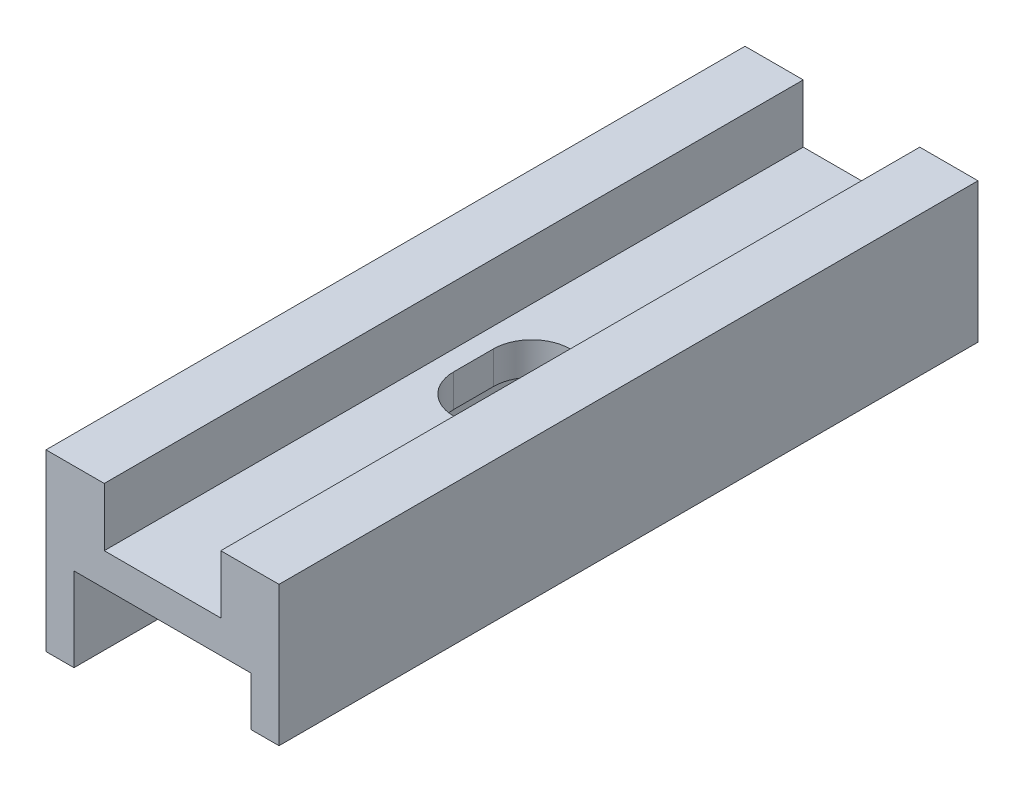
ISO-10303-21;
HEADER;
FILE_DESCRIPTION(('STEP AP214'),'2;1');
FILE_NAME('part.step','',(''),(''),'','','');
FILE_SCHEMA(('AUTOMOTIVE_DESIGN { 1 0 10303 214 1 1 1 1 }'));
ENDSEC;
DATA;
#1=APPLICATION_CONTEXT('core data for automotive mechanical design processes');
#2=APPLICATION_PROTOCOL_DEFINITION('international standard','automotive_design',2000,#1);
#3=PRODUCT_CONTEXT('',#1,'mechanical');
#4=PRODUCT('Part','Part','',(#3));
#5=PRODUCT_RELATED_PRODUCT_CATEGORY('part','',(#4));
#6=PRODUCT_DEFINITION_FORMATION('','',#4);
#7=PRODUCT_DEFINITION_CONTEXT('part definition',#1,'design');
#8=PRODUCT_DEFINITION('design','',#6,#7);
#9=PRODUCT_DEFINITION_SHAPE('','',#8);
#10=(LENGTH_UNIT() NAMED_UNIT(*) SI_UNIT(.MILLI.,.METRE.));
#11=(NAMED_UNIT(*) PLANE_ANGLE_UNIT() SI_UNIT($,.RADIAN.));
#12=(NAMED_UNIT(*) SI_UNIT($,.STERADIAN.) SOLID_ANGLE_UNIT());
#13=UNCERTAINTY_MEASURE_WITH_UNIT(LENGTH_MEASURE(1.E-05),#10,'distance_accuracy_value','');
#14=(GEOMETRIC_REPRESENTATION_CONTEXT(3) GLOBAL_UNCERTAINTY_ASSIGNED_CONTEXT((#13)) GLOBAL_UNIT_ASSIGNED_CONTEXT((#10,
#11,#12)) REPRESENTATION_CONTEXT('',''));
#15=CARTESIAN_POINT('',(0.,0.,0.));
#16=DIRECTION('',(0.,0.,1.));
#17=DIRECTION('',(1.,0.,0.));
#18=AXIS2_PLACEMENT_3D('',#15,#16,#17);
#19=CARTESIAN_POINT('',(6.35,1.26999999999999,38.1));
#20=DIRECTION('',(-1.,0.,0.));
#21=DIRECTION('',(0.,-1.,0.));
#22=AXIS2_PLACEMENT_3D('',#19,#20,#21);
#23=PLANE('',#22);
#24=DIRECTION('',(0.,1.,0.));
#25=VECTOR('',#24,1.);
#26=CARTESIAN_POINT('',(6.35,1.26999999999999,-38.1));
#27=LINE('',#26,#25);
#28=CARTESIAN_POINT('',(6.35,1.26999999999999,-38.1));
#29=VERTEX_POINT('',#28);
#30=CARTESIAN_POINT('',(6.35,7.62,-38.1));
#31=VERTEX_POINT('',#30);
#32=EDGE_CURVE('E160',#29,#31,#27,.T.);
#33=ORIENTED_EDGE('',*,*,#32,.F.);
#34=DIRECTION('',(0.,0.,-1.));
#35=VECTOR('',#34,1.);
#36=CARTESIAN_POINT('',(6.35,1.26999999999999,38.1));
#37=LINE('',#36,#35);
#38=CARTESIAN_POINT('',(6.35,1.26999999999999,38.1));
#39=VERTEX_POINT('',#38);
#40=EDGE_CURVE('E11',#39,#29,#37,.T.);
#41=ORIENTED_EDGE('',*,*,#40,.F.);
#42=DIRECTION('',(0.,1.,0.));
#43=VECTOR('',#42,1.);
#44=CARTESIAN_POINT('',(6.35,1.26999999999999,38.1));
#45=LINE('',#44,#43);
#46=CARTESIAN_POINT('',(6.35,7.62,38.1));
#47=VERTEX_POINT('',#46);
#48=EDGE_CURVE('E199',#39,#47,#45,.T.);
#49=ORIENTED_EDGE('',*,*,#48,.T.);
#50=DIRECTION('',(0.,0.,-1.));
#51=VECTOR('',#50,1.);
#52=CARTESIAN_POINT('',(6.35,7.62,38.1));
#53=LINE('',#52,#51);
#54=EDGE_CURVE('E42',#47,#31,#53,.T.);
#55=ORIENTED_EDGE('',*,*,#54,.T.);
#56=EDGE_LOOP('',(#33,#41,#49,#55));
#57=FACE_BOUND('',#56,.T.);
#58=ADVANCED_FACE('F39',(#57),#23,.T.);
#59=CARTESIAN_POINT('',(-6.35,1.26999999999999,38.1));
#60=DIRECTION('',(0.,1.,0.));
#61=DIRECTION('',(0.,0.,1.));
#62=AXIS2_PLACEMENT_3D('',#59,#60,#61);
#63=PLANE('',#62);
#64=DIRECTION('',(0.,0.,1.));
#65=VECTOR('',#64,1.);
#66=CARTESIAN_POINT('',(-4.191,1.26999999999999,-2.159));
#67=LINE('',#66,#65);
#68=CARTESIAN_POINT('',(-4.191,1.26999999999999,-2.159));
#69=VERTEX_POINT('',#68);
#70=CARTESIAN_POINT('',(-4.191,1.26999999999999,2.159));
#71=VERTEX_POINT('',#70);
#72=EDGE_CURVE('E56',#69,#71,#67,.T.);
#73=ORIENTED_EDGE('',*,*,#72,.F.);
#74=CARTESIAN_POINT('',(0.,1.26999999999999,-2.159));
#75=DIRECTION('',(0.,1.,0.));
#76=DIRECTION('',(0.,0.,1.));
#77=AXIS2_PLACEMENT_3D('',#74,#75,#76);
#78=CIRCLE('',#77,4.191);
#79=CARTESIAN_POINT('',(4.191,1.26999999999999,-2.159));
#80=VERTEX_POINT('',#79);
#81=EDGE_CURVE('E167',#80,#69,#78,.T.);
#82=ORIENTED_EDGE('',*,*,#81,.F.);
#83=DIRECTION('',(0.,0.,1.));
#84=VECTOR('',#83,1.);
#85=CARTESIAN_POINT('',(4.191,1.26999999999999,-2.159));
#86=LINE('',#85,#84);
#87=CARTESIAN_POINT('',(4.191,1.26999999999999,2.159));
#88=VERTEX_POINT('',#87);
#89=EDGE_CURVE('E185',#80,#88,#86,.T.);
#90=ORIENTED_EDGE('',*,*,#89,.T.);
#91=CARTESIAN_POINT('',(0.,1.26999999999999,2.159));
#92=DIRECTION('',(0.,1.,0.));
#93=DIRECTION('',(0.,0.,1.));
#94=AXIS2_PLACEMENT_3D('',#91,#92,#93);
#95=CIRCLE('',#94,4.191);
#96=EDGE_CURVE('E177',#71,#88,#95,.T.);
#97=ORIENTED_EDGE('',*,*,#96,.F.);
#98=EDGE_LOOP('',(#73,#82,#90,#97));
#99=FACE_BOUND('',#98,.T.);
#100=DIRECTION('',(1.,0.,0.));
#101=VECTOR('',#100,1.);
#102=CARTESIAN_POINT('',(-6.35,1.26999999999999,-38.1));
#103=LINE('',#102,#101);
#104=CARTESIAN_POINT('',(-6.35,1.26999999999999,-38.1));
#105=VERTEX_POINT('',#104);
#106=EDGE_CURVE('E204',#105,#29,#103,.T.);
#107=ORIENTED_EDGE('',*,*,#106,.F.);
#108=DIRECTION('',(0.,0.,-1.));
#109=VECTOR('',#108,1.);
#110=CARTESIAN_POINT('',(-6.35,1.26999999999999,38.1));
#111=LINE('',#110,#109);
#112=CARTESIAN_POINT('',(-6.35,1.26999999999999,38.1));
#113=VERTEX_POINT('',#112);
#114=EDGE_CURVE('E48',#113,#105,#111,.T.);
#115=ORIENTED_EDGE('',*,*,#114,.F.);
#116=DIRECTION('',(1.,0.,0.));
#117=VECTOR('',#116,1.);
#118=CARTESIAN_POINT('',(-6.35,1.26999999999999,38.1));
#119=LINE('',#118,#117);
#120=EDGE_CURVE('E244',#113,#39,#119,.T.);
#121=ORIENTED_EDGE('',*,*,#120,.T.);
#122=ORIENTED_EDGE('',*,*,#40,.T.);
#123=EDGE_LOOP('',(#107,#115,#121,#122));
#124=FACE_BOUND('',#123,.T.);
#125=ADVANCED_FACE('F335',(#99,#124),#63,.T.);
#126=CARTESIAN_POINT('',(-6.35,7.61999999999999,38.1));
#127=DIRECTION('',(1.,0.,0.));
#128=DIRECTION('',(0.,1.,0.));
#129=AXIS2_PLACEMENT_3D('',#126,#127,#128);
#130=PLANE('',#129);
#131=DIRECTION('',(0.,-1.,0.));
#132=VECTOR('',#131,1.);
#133=CARTESIAN_POINT('',(-6.35,7.61999999999999,-38.1));
#134=LINE('',#133,#132);
#135=CARTESIAN_POINT('',(-6.35,7.61999999999999,-38.1));
#136=VERTEX_POINT('',#135);
#137=EDGE_CURVE('E287',#136,#105,#134,.T.);
#138=ORIENTED_EDGE('',*,*,#137,.F.);
#139=DIRECTION('',(0.,0.,-1.));
#140=VECTOR('',#139,1.);
#141=CARTESIAN_POINT('',(-6.35,7.61999999999999,38.1));
#142=LINE('',#141,#140);
#143=CARTESIAN_POINT('',(-6.35,7.61999999999999,38.1));
#144=VERTEX_POINT('',#143);
#145=EDGE_CURVE('E296',#144,#136,#142,.T.);
#146=ORIENTED_EDGE('',*,*,#145,.F.);
#147=DIRECTION('',(0.,-1.,0.));
#148=VECTOR('',#147,1.);
#149=CARTESIAN_POINT('',(-6.35,7.61999999999999,38.1));
#150=LINE('',#149,#148);
#151=EDGE_CURVE('E240',#144,#113,#150,.T.);
#152=ORIENTED_EDGE('',*,*,#151,.T.);
#153=ORIENTED_EDGE('',*,*,#114,.T.);
#154=EDGE_LOOP('',(#138,#146,#152,#153));
#155=FACE_BOUND('',#154,.T.);
#156=ADVANCED_FACE('F370',(#155),#130,.T.);
#157=CARTESIAN_POINT('',(-12.7,7.62,38.1));
#158=DIRECTION('',(0.,1.,0.));
#159=DIRECTION('',(-1.,0.,0.));
#160=AXIS2_PLACEMENT_3D('',#157,#158,#159);
#161=PLANE('',#160);
#162=DIRECTION('',(1.,0.,0.));
#163=VECTOR('',#162,1.);
#164=CARTESIAN_POINT('',(-12.7,7.62,-38.1));
#165=LINE('',#164,#163);
#166=CARTESIAN_POINT('',(-12.7,7.62,-38.1));
#167=VERTEX_POINT('',#166);
#168=EDGE_CURVE('E283',#167,#136,#165,.T.);
#169=ORIENTED_EDGE('',*,*,#168,.F.);
#170=DIRECTION('',(0.,0.,-1.));
#171=VECTOR('',#170,1.);
#172=CARTESIAN_POINT('',(-12.7,7.62,38.1));
#173=LINE('',#172,#171);
#174=CARTESIAN_POINT('',(-12.7,7.62,38.1));
#175=VERTEX_POINT('',#174);
#176=EDGE_CURVE('E299',#175,#167,#173,.T.);
#177=ORIENTED_EDGE('',*,*,#176,.F.);
#178=DIRECTION('',(1.,0.,0.));
#179=VECTOR('',#178,1.);
#180=CARTESIAN_POINT('',(-12.7,7.62,38.1));
#181=LINE('',#180,#179);
#182=EDGE_CURVE('E236',#175,#144,#181,.T.);
#183=ORIENTED_EDGE('',*,*,#182,.T.);
#184=ORIENTED_EDGE('',*,*,#145,.T.);
#185=EDGE_LOOP('',(#169,#177,#183,#184));
#186=FACE_BOUND('',#185,.T.);
#187=ADVANCED_FACE('F367',(#186),#161,.T.);
#188=CARTESIAN_POINT('',(-12.7,-11.43,38.1));
#189=DIRECTION('',(-1.,0.,0.));
#190=DIRECTION('',(0.,-1.,0.));
#191=AXIS2_PLACEMENT_3D('',#188,#189,#190);
#192=PLANE('',#191);
#193=DIRECTION('',(0.,1.,0.));
#194=VECTOR('',#193,1.);
#195=CARTESIAN_POINT('',(-12.7,-11.43,-38.1));
#196=LINE('',#195,#194);
#197=CARTESIAN_POINT('',(-12.7,-11.43,-38.1));
#198=VERTEX_POINT('',#197);
#199=EDGE_CURVE('E279',#198,#167,#196,.T.);
#200=ORIENTED_EDGE('',*,*,#199,.F.);
#201=DIRECTION('',(0.,0.,-1.));
#202=VECTOR('',#201,1.);
#203=CARTESIAN_POINT('',(-12.7,-11.43,38.1));
#204=LINE('',#203,#202);
#205=CARTESIAN_POINT('',(-12.7,-11.43,38.1));
#206=VERTEX_POINT('',#205);
#207=EDGE_CURVE('E302',#206,#198,#204,.T.);
#208=ORIENTED_EDGE('',*,*,#207,.F.);
#209=DIRECTION('',(0.,1.,0.));
#210=VECTOR('',#209,1.);
#211=CARTESIAN_POINT('',(-12.7,-11.43,38.1));
#212=LINE('',#211,#210);
#213=EDGE_CURVE('E232',#206,#175,#212,.T.);
#214=ORIENTED_EDGE('',*,*,#213,.T.);
#215=ORIENTED_EDGE('',*,*,#176,.T.);
#216=EDGE_LOOP('',(#200,#208,#214,#215));
#217=FACE_BOUND('',#216,.T.);
#218=ADVANCED_FACE('F364',(#217),#192,.T.);
#219=CARTESIAN_POINT('',(-9.652,-11.43,38.1));
#220=DIRECTION('',(0.,-1.,0.));
#221=DIRECTION('',(1.,0.,0.));
#222=AXIS2_PLACEMENT_3D('',#219,#220,#221);
#223=PLANE('',#222);
#224=DIRECTION('',(-1.,0.,0.));
#225=VECTOR('',#224,1.);
#226=CARTESIAN_POINT('',(-9.652,-11.43,-38.1));
#227=LINE('',#226,#225);
#228=CARTESIAN_POINT('',(-9.652,-11.43,-38.1));
#229=VERTEX_POINT('',#228);
#230=EDGE_CURVE('E275',#229,#198,#227,.T.);
#231=ORIENTED_EDGE('',*,*,#230,.F.);
#232=DIRECTION('',(0.,0.,-1.));
#233=VECTOR('',#232,1.);
#234=CARTESIAN_POINT('',(-9.652,-11.43,38.1));
#235=LINE('',#234,#233);
#236=CARTESIAN_POINT('',(-9.652,-11.43,38.1));
#237=VERTEX_POINT('',#236);
#238=EDGE_CURVE('E305',#237,#229,#235,.T.);
#239=ORIENTED_EDGE('',*,*,#238,.F.);
#240=DIRECTION('',(-1.,0.,0.));
#241=VECTOR('',#240,1.);
#242=CARTESIAN_POINT('',(-9.652,-11.43,38.1));
#243=LINE('',#242,#241);
#244=EDGE_CURVE('E228',#237,#206,#243,.T.);
#245=ORIENTED_EDGE('',*,*,#244,.T.);
#246=ORIENTED_EDGE('',*,*,#207,.T.);
#247=EDGE_LOOP('',(#231,#239,#245,#246));
#248=FACE_BOUND('',#247,.T.);
#249=ADVANCED_FACE('F360',(#248),#223,.T.);
#250=CARTESIAN_POINT('',(-9.652,-2.286,38.1));
#251=DIRECTION('',(1.,0.,0.));
#252=DIRECTION('',(0.,1.,0.));
#253=AXIS2_PLACEMENT_3D('',#250,#251,#252);
#254=PLANE('',#253);
#255=DIRECTION('',(0.,-1.,0.));
#256=VECTOR('',#255,1.);
#257=CARTESIAN_POINT('',(-9.652,-2.286,-38.1));
#258=LINE('',#257,#256);
#259=CARTESIAN_POINT('',(-9.652,-2.286,-38.1));
#260=VERTEX_POINT('',#259);
#261=EDGE_CURVE('E271',#260,#229,#258,.T.);
#262=ORIENTED_EDGE('',*,*,#261,.F.);
#263=DIRECTION('',(0.,0.,-1.));
#264=VECTOR('',#263,1.);
#265=CARTESIAN_POINT('',(-9.652,-2.286,38.1));
#266=LINE('',#265,#264);
#267=CARTESIAN_POINT('',(-9.652,-2.286,38.1));
#268=VERTEX_POINT('',#267);
#269=EDGE_CURVE('E308',#268,#260,#266,.T.);
#270=ORIENTED_EDGE('',*,*,#269,.F.);
#271=DIRECTION('',(0.,-1.,0.));
#272=VECTOR('',#271,1.);
#273=CARTESIAN_POINT('',(-9.652,-2.286,38.1));
#274=LINE('',#273,#272);
#275=EDGE_CURVE('E224',#268,#237,#274,.T.);
#276=ORIENTED_EDGE('',*,*,#275,.T.);
#277=ORIENTED_EDGE('',*,*,#238,.T.);
#278=EDGE_LOOP('',(#262,#270,#276,#277));
#279=FACE_BOUND('',#278,.T.);
#280=ADVANCED_FACE('F356',(#279),#254,.T.);
#281=CARTESIAN_POINT('',(9.65199999999999,-2.286,38.1));
#282=DIRECTION('',(0.,-1.,0.));
#283=DIRECTION('',(1.,0.,0.));
#284=AXIS2_PLACEMENT_3D('',#281,#282,#283);
#285=PLANE('',#284);
#286=DIRECTION('',(0.,0.,1.));
#287=VECTOR('',#286,1.);
#288=CARTESIAN_POINT('',(-4.191,-2.286,-2.159));
#289=LINE('',#288,#287);
#290=CARTESIAN_POINT('',(-4.191,-2.286,-2.159));
#291=VERTEX_POINT('',#290);
#292=CARTESIAN_POINT('',(-4.191,-2.286,2.159));
#293=VERTEX_POINT('',#292);
#294=EDGE_CURVE('E164',#291,#293,#289,.T.);
#295=ORIENTED_EDGE('',*,*,#294,.T.);
#296=CARTESIAN_POINT('',(0.,-2.286,2.159));
#297=DIRECTION('',(0.,-1.,0.));
#298=DIRECTION('',(1.,0.,0.));
#299=AXIS2_PLACEMENT_3D('',#296,#297,#298);
#300=CIRCLE('',#299,4.191);
#301=CARTESIAN_POINT('',(4.191,-2.286,2.159));
#302=VERTEX_POINT('',#301);
#303=EDGE_CURVE('E152',#293,#302,#300,.F.);
#304=ORIENTED_EDGE('',*,*,#303,.T.);
#305=DIRECTION('',(0.,0.,1.));
#306=VECTOR('',#305,1.);
#307=CARTESIAN_POINT('',(4.191,-2.286,-2.159));
#308=LINE('',#307,#306);
#309=CARTESIAN_POINT('',(4.191,-2.286,-2.159));
#310=VERTEX_POINT('',#309);
#311=EDGE_CURVE('E179',#310,#302,#308,.T.);
#312=ORIENTED_EDGE('',*,*,#311,.F.);
#313=CARTESIAN_POINT('',(0.,-2.286,-2.159));
#314=DIRECTION('',(0.,-1.,0.));
#315=DIRECTION('',(1.,0.,0.));
#316=AXIS2_PLACEMENT_3D('',#313,#314,#315);
#317=CIRCLE('',#316,4.191);
#318=EDGE_CURVE('E172',#310,#291,#317,.F.);
#319=ORIENTED_EDGE('',*,*,#318,.T.);
#320=EDGE_LOOP('',(#295,#304,#312,#319));
#321=FACE_BOUND('',#320,.T.);
#322=DIRECTION('',(-1.,0.,0.));
#323=VECTOR('',#322,1.);
#324=CARTESIAN_POINT('',(9.65199999999999,-2.286,-38.1));
#325=LINE('',#324,#323);
#326=CARTESIAN_POINT('',(9.65199999999999,-2.286,-38.1));
#327=VERTEX_POINT('',#326);
#328=EDGE_CURVE('E267',#327,#260,#325,.T.);
#329=ORIENTED_EDGE('',*,*,#328,.F.);
#330=DIRECTION('',(0.,0.,-1.));
#331=VECTOR('',#330,1.);
#332=CARTESIAN_POINT('',(9.65199999999999,-2.286,38.1));
#333=LINE('',#332,#331);
#334=CARTESIAN_POINT('',(9.65199999999999,-2.286,38.1));
#335=VERTEX_POINT('',#334);
#336=EDGE_CURVE('E311',#335,#327,#333,.T.);
#337=ORIENTED_EDGE('',*,*,#336,.F.);
#338=DIRECTION('',(-1.,0.,0.));
#339=VECTOR('',#338,1.);
#340=CARTESIAN_POINT('',(9.65199999999999,-2.286,38.1));
#341=LINE('',#340,#339);
#342=EDGE_CURVE('E220',#335,#268,#341,.T.);
#343=ORIENTED_EDGE('',*,*,#342,.T.);
#344=ORIENTED_EDGE('',*,*,#269,.T.);
#345=EDGE_LOOP('',(#329,#337,#343,#344));
#346=FACE_BOUND('',#345,.T.);
#347=ADVANCED_FACE('F170',(#321,#346),#285,.T.);
#348=CARTESIAN_POINT('',(9.652,-7.61999999999999,38.1));
#349=DIRECTION('',(-1.,0.,0.));
#350=DIRECTION('',(0.,-1.,0.));
#351=AXIS2_PLACEMENT_3D('',#348,#349,#350);
#352=PLANE('',#351);
#353=DIRECTION('',(0.,1.,0.));
#354=VECTOR('',#353,1.);
#355=CARTESIAN_POINT('',(9.652,-7.61999999999999,-38.1));
#356=LINE('',#355,#354);
#357=CARTESIAN_POINT('',(9.652,-7.61999999999999,-38.1));
#358=VERTEX_POINT('',#357);
#359=EDGE_CURVE('E263',#358,#327,#356,.T.);
#360=ORIENTED_EDGE('',*,*,#359,.F.);
#361=DIRECTION('',(0.,0.,-1.));
#362=VECTOR('',#361,1.);
#363=CARTESIAN_POINT('',(9.652,-7.61999999999999,38.1));
#364=LINE('',#363,#362);
#365=CARTESIAN_POINT('',(9.652,-7.61999999999999,38.1));
#366=VERTEX_POINT('',#365);
#367=EDGE_CURVE('E314',#366,#358,#364,.T.);
#368=ORIENTED_EDGE('',*,*,#367,.F.);
#369=DIRECTION('',(0.,1.,0.));
#370=VECTOR('',#369,1.);
#371=CARTESIAN_POINT('',(9.652,-7.61999999999999,38.1));
#372=LINE('',#371,#370);
#373=EDGE_CURVE('E216',#366,#335,#372,.T.);
#374=ORIENTED_EDGE('',*,*,#373,.T.);
#375=ORIENTED_EDGE('',*,*,#336,.T.);
#376=EDGE_LOOP('',(#360,#368,#374,#375));
#377=FACE_BOUND('',#376,.T.);
#378=ADVANCED_FACE('F350',(#377),#352,.T.);
#379=CARTESIAN_POINT('',(12.7,-7.61999999999999,38.1));
#380=DIRECTION('',(0.,-1.,0.));
#381=DIRECTION('',(1.,0.,0.));
#382=AXIS2_PLACEMENT_3D('',#379,#380,#381);
#383=PLANE('',#382);
#384=DIRECTION('',(-1.,0.,0.));
#385=VECTOR('',#384,1.);
#386=CARTESIAN_POINT('',(12.7,-7.61999999999999,-38.1));
#387=LINE('',#386,#385);
#388=CARTESIAN_POINT('',(12.7,-7.61999999999999,-38.1));
#389=VERTEX_POINT('',#388);
#390=EDGE_CURVE('E259',#389,#358,#387,.T.);
#391=ORIENTED_EDGE('',*,*,#390,.F.);
#392=DIRECTION('',(0.,0.,-1.));
#393=VECTOR('',#392,1.);
#394=CARTESIAN_POINT('',(12.7,-7.61999999999999,38.1));
#395=LINE('',#394,#393);
#396=CARTESIAN_POINT('',(12.7,-7.61999999999999,38.1));
#397=VERTEX_POINT('',#396);
#398=EDGE_CURVE('E317',#397,#389,#395,.T.);
#399=ORIENTED_EDGE('',*,*,#398,.F.);
#400=DIRECTION('',(-1.,0.,0.));
#401=VECTOR('',#400,1.);
#402=CARTESIAN_POINT('',(12.7,-7.61999999999999,38.1));
#403=LINE('',#402,#401);
#404=EDGE_CURVE('E212',#397,#366,#403,.T.);
#405=ORIENTED_EDGE('',*,*,#404,.T.);
#406=ORIENTED_EDGE('',*,*,#367,.T.);
#407=EDGE_LOOP('',(#391,#399,#405,#406));
#408=FACE_BOUND('',#407,.T.);
#409=ADVANCED_FACE('F348',(#408),#383,.T.);
#410=CARTESIAN_POINT('',(12.7,7.61999999999999,38.1));
#411=DIRECTION('',(1.,0.,0.));
#412=DIRECTION('',(0.,1.,0.));
#413=AXIS2_PLACEMENT_3D('',#410,#411,#412);
#414=PLANE('',#413);
#415=DIRECTION('',(0.,-1.,0.));
#416=VECTOR('',#415,1.);
#417=CARTESIAN_POINT('',(12.7,7.61999999999999,-38.1));
#418=LINE('',#417,#416);
#419=CARTESIAN_POINT('',(12.7,7.61999999999999,-38.1));
#420=VERTEX_POINT('',#419);
#421=EDGE_CURVE('E255',#420,#389,#418,.T.);
#422=ORIENTED_EDGE('',*,*,#421,.F.);
#423=DIRECTION('',(0.,0.,-1.));
#424=VECTOR('',#423,1.);
#425=CARTESIAN_POINT('',(12.7,7.61999999999999,38.1));
#426=LINE('',#425,#424);
#427=CARTESIAN_POINT('',(12.7,7.61999999999999,38.1));
#428=VERTEX_POINT('',#427);
#429=EDGE_CURVE('E319',#428,#420,#426,.T.);
#430=ORIENTED_EDGE('',*,*,#429,.F.);
#431=DIRECTION('',(0.,-1.,0.));
#432=VECTOR('',#431,1.);
#433=CARTESIAN_POINT('',(12.7,7.61999999999999,38.1));
#434=LINE('',#433,#432);
#435=EDGE_CURVE('E208',#428,#397,#434,.T.);
#436=ORIENTED_EDGE('',*,*,#435,.T.);
#437=ORIENTED_EDGE('',*,*,#398,.T.);
#438=EDGE_LOOP('',(#422,#430,#436,#437));
#439=FACE_BOUND('',#438,.T.);
#440=ADVANCED_FACE('F344',(#439),#414,.T.);
#441=CARTESIAN_POINT('',(6.35,7.62,38.1));
#442=DIRECTION('',(0.,1.,0.));
#443=DIRECTION('',(-1.,0.,0.));
#444=AXIS2_PLACEMENT_3D('',#441,#442,#443);
#445=PLANE('',#444);
#446=DIRECTION('',(1.,0.,0.));
#447=VECTOR('',#446,1.);
#448=CARTESIAN_POINT('',(6.35,7.62,-38.1));
#449=LINE('',#448,#447);
#450=EDGE_CURVE('E251',#31,#420,#449,.T.);
#451=ORIENTED_EDGE('',*,*,#450,.F.);
#452=ORIENTED_EDGE('',*,*,#54,.F.);
#453=DIRECTION('',(1.,0.,0.));
#454=VECTOR('',#453,1.);
#455=CARTESIAN_POINT('',(6.35,7.62,38.1));
#456=LINE('',#455,#454);
#457=EDGE_CURVE('E203',#47,#428,#456,.T.);
#458=ORIENTED_EDGE('',*,*,#457,.T.);
#459=ORIENTED_EDGE('',*,*,#429,.T.);
#460=EDGE_LOOP('',(#451,#452,#458,#459));
#461=FACE_BOUND('',#460,.T.);
#462=ADVANCED_FACE('F329',(#461),#445,.T.);
#463=CARTESIAN_POINT('',(0.,0.,38.1));
#464=DIRECTION('',(0.,0.,-1.));
#465=DIRECTION('',(-1.,0.,0.));
#466=AXIS2_PLACEMENT_3D('',#463,#464,#465);
#467=PLANE('',#466);
#468=ORIENTED_EDGE('',*,*,#48,.F.);
#469=ORIENTED_EDGE('',*,*,#120,.F.);
#470=ORIENTED_EDGE('',*,*,#151,.F.);
#471=ORIENTED_EDGE('',*,*,#182,.F.);
#472=ORIENTED_EDGE('',*,*,#213,.F.);
#473=ORIENTED_EDGE('',*,*,#244,.F.);
#474=ORIENTED_EDGE('',*,*,#275,.F.);
#475=ORIENTED_EDGE('',*,*,#342,.F.);
#476=ORIENTED_EDGE('',*,*,#373,.F.);
#477=ORIENTED_EDGE('',*,*,#404,.F.);
#478=ORIENTED_EDGE('',*,*,#435,.F.);
#479=ORIENTED_EDGE('',*,*,#457,.F.);
#480=EDGE_LOOP('',(#468,#469,#470,#471,#472,#473,#474,#475,#476,#477,#478,#479));
#481=FACE_BOUND('',#480,.T.);
#482=ADVANCED_FACE('F338',(#481),#467,.F.);
#483=CARTESIAN_POINT('',(0.,0.,-38.1));
#484=DIRECTION('',(0.,0.,-1.));
#485=DIRECTION('',(-1.,0.,0.));
#486=AXIS2_PLACEMENT_3D('',#483,#484,#485);
#487=PLANE('',#486);
#488=ORIENTED_EDGE('',*,*,#32,.T.);
#489=ORIENTED_EDGE('',*,*,#450,.T.);
#490=ORIENTED_EDGE('',*,*,#421,.T.);
#491=ORIENTED_EDGE('',*,*,#390,.T.);
#492=ORIENTED_EDGE('',*,*,#359,.T.);
#493=ORIENTED_EDGE('',*,*,#328,.T.);
#494=ORIENTED_EDGE('',*,*,#261,.T.);
#495=ORIENTED_EDGE('',*,*,#230,.T.);
#496=ORIENTED_EDGE('',*,*,#199,.T.);
#497=ORIENTED_EDGE('',*,*,#168,.T.);
#498=ORIENTED_EDGE('',*,*,#137,.T.);
#499=ORIENTED_EDGE('',*,*,#106,.T.);
#500=EDGE_LOOP('',(#488,#489,#490,#491,#492,#493,#494,#495,#496,#497,#498,#499));
#501=FACE_BOUND('',#500,.T.);
#502=ADVANCED_FACE('F331',(#501),#487,.T.);
#503=CARTESIAN_POINT('',(-4.191,-11.431,-2.159));
#504=DIRECTION('',(-1.,0.,0.));
#505=DIRECTION('',(0.,0.,1.));
#506=AXIS2_PLACEMENT_3D('',#503,#504,#505);
#507=PLANE('',#506);
#508=DIRECTION('',(0.,1.,0.));
#509=VECTOR('',#508,1.);
#510=CARTESIAN_POINT('',(-4.191,-11.431,-2.159));
#511=LINE('',#510,#509);
#512=EDGE_CURVE('E161',#291,#69,#511,.T.);
#513=ORIENTED_EDGE('',*,*,#512,.T.);
#514=ORIENTED_EDGE('',*,*,#72,.T.);
#515=DIRECTION('',(0.,1.,0.));
#516=VECTOR('',#515,1.);
#517=CARTESIAN_POINT('',(-4.191,-11.431,2.159));
#518=LINE('',#517,#516);
#519=EDGE_CURVE('E154',#293,#71,#518,.T.);
#520=ORIENTED_EDGE('',*,*,#519,.F.);
#521=ORIENTED_EDGE('',*,*,#294,.F.);
#522=EDGE_LOOP('',(#513,#514,#520,#521));
#523=FACE_BOUND('',#522,.T.);
#524=ADVANCED_FACE('F163',(#523),#507,.F.);
#525=CARTESIAN_POINT('',(0.,-11.431,-2.159));
#526=DIRECTION('',(0.,1.,0.));
#527=DIRECTION('',(0.,0.,1.));
#528=AXIS2_PLACEMENT_3D('',#525,#526,#527);
#529=CYLINDRICAL_SURFACE('',#528,4.191);
#530=DIRECTION('',(0.,1.,0.));
#531=VECTOR('',#530,1.);
#532=CARTESIAN_POINT('',(4.191,-11.431,-2.159));
#533=LINE('',#532,#531);
#534=EDGE_CURVE('E194',#310,#80,#533,.T.);
#535=ORIENTED_EDGE('',*,*,#534,.T.);
#536=ORIENTED_EDGE('',*,*,#81,.T.);
#537=ORIENTED_EDGE('',*,*,#512,.F.);
#538=ORIENTED_EDGE('',*,*,#318,.F.);
#539=EDGE_LOOP('',(#535,#536,#537,#538));
#540=FACE_BOUND('',#539,.T.);
#541=ADVANCED_FACE('F414',(#540),#529,.F.);
#542=CARTESIAN_POINT('',(4.191,-11.431,-2.159));
#543=DIRECTION('',(-1.,0.,0.));
#544=DIRECTION('',(0.,0.,1.));
#545=AXIS2_PLACEMENT_3D('',#542,#543,#544);
#546=PLANE('',#545);
#547=ORIENTED_EDGE('',*,*,#311,.T.);
#548=DIRECTION('',(0.,1.,0.));
#549=VECTOR('',#548,1.);
#550=CARTESIAN_POINT('',(4.191,-11.431,2.159));
#551=LINE('',#550,#549);
#552=EDGE_CURVE('E64',#302,#88,#551,.T.);
#553=ORIENTED_EDGE('',*,*,#552,.T.);
#554=ORIENTED_EDGE('',*,*,#89,.F.);
#555=ORIENTED_EDGE('',*,*,#534,.F.);
#556=EDGE_LOOP('',(#547,#553,#554,#555));
#557=FACE_BOUND('',#556,.T.);
#558=ADVANCED_FACE('F423',(#557),#546,.T.);
#559=CARTESIAN_POINT('',(0.,-11.431,2.159));
#560=DIRECTION('',(0.,1.,0.));
#561=DIRECTION('',(0.,0.,1.));
#562=AXIS2_PLACEMENT_3D('',#559,#560,#561);
#563=CYLINDRICAL_SURFACE('',#562,4.191);
#564=ORIENTED_EDGE('',*,*,#519,.T.);
#565=ORIENTED_EDGE('',*,*,#96,.T.);
#566=ORIENTED_EDGE('',*,*,#552,.F.);
#567=ORIENTED_EDGE('',*,*,#303,.F.);
#568=EDGE_LOOP('',(#564,#565,#566,#567));
#569=FACE_BOUND('',#568,.T.);
#570=ADVANCED_FACE('F153',(#569),#563,.F.);
#571=CLOSED_SHELL('',(#58,#125,#156,#187,#218,#249,#280,#347,#378,#409,#440,#462,#482,#502,#524,
#541,#558,#570));
#572=MANIFOLD_SOLID_BREP('B2',#571);
#573=ADVANCED_BREP_SHAPE_REPRESENTATION('',(#18,#572),#14);
#574=SHAPE_DEFINITION_REPRESENTATION(#9,#573);
ENDSEC;
END-ISO-10303-21;
